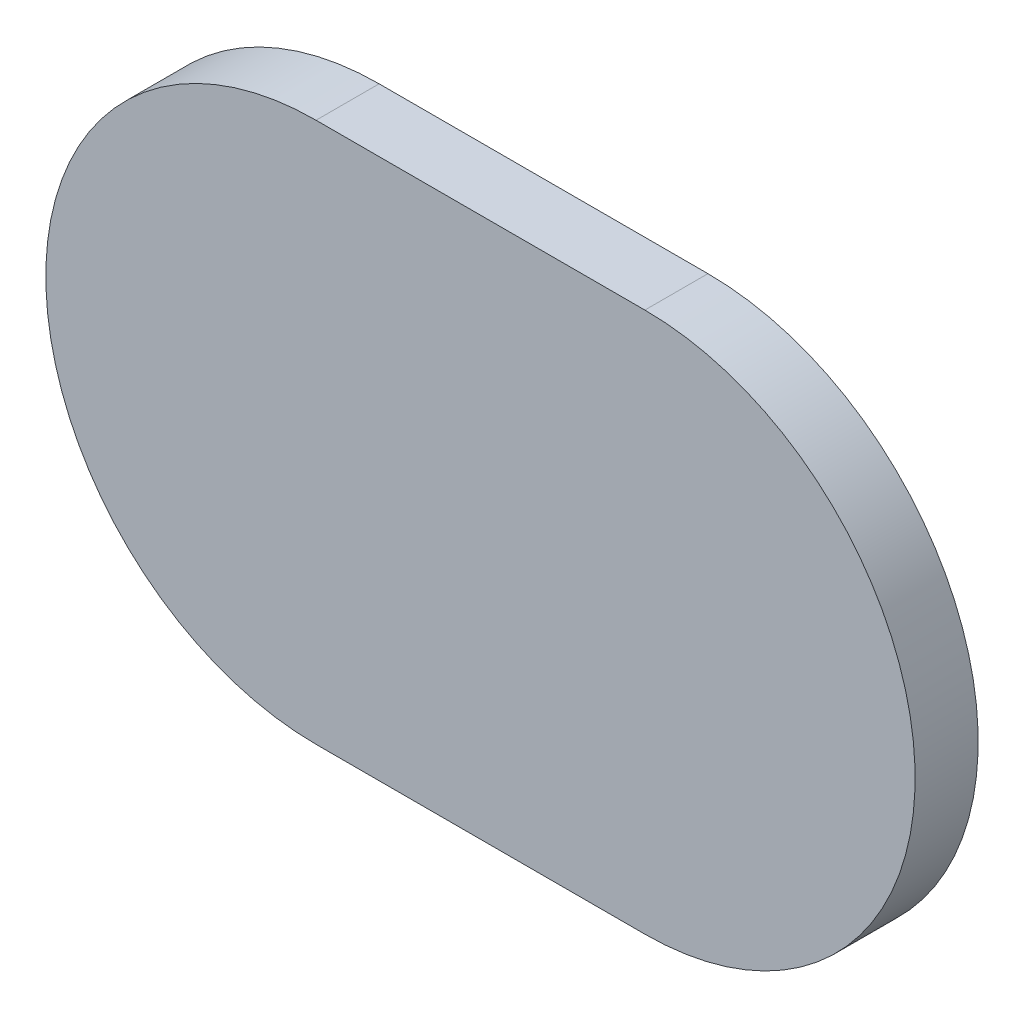
ISO-10303-21;
HEADER;
FILE_DESCRIPTION(('STEP AP214'),'2;1');
FILE_NAME('part.step','',(''),(''),'','','');
FILE_SCHEMA(('AUTOMOTIVE_DESIGN { 1 0 10303 214 1 1 1 1 }'));
ENDSEC;
DATA;
#1=APPLICATION_CONTEXT('core data for automotive mechanical design processes');
#2=APPLICATION_PROTOCOL_DEFINITION('international standard','automotive_design',2000,#1);
#3=PRODUCT_CONTEXT('',#1,'mechanical');
#4=PRODUCT('Part','Part','',(#3));
#5=PRODUCT_RELATED_PRODUCT_CATEGORY('part','',(#4));
#6=PRODUCT_DEFINITION_FORMATION('','',#4);
#7=PRODUCT_DEFINITION_CONTEXT('part definition',#1,'design');
#8=PRODUCT_DEFINITION('design','',#6,#7);
#9=PRODUCT_DEFINITION_SHAPE('','',#8);
#10=(LENGTH_UNIT() NAMED_UNIT(*) SI_UNIT(.MILLI.,.METRE.));
#11=(NAMED_UNIT(*) PLANE_ANGLE_UNIT() SI_UNIT($,.RADIAN.));
#12=(NAMED_UNIT(*) SI_UNIT($,.STERADIAN.) SOLID_ANGLE_UNIT());
#13=UNCERTAINTY_MEASURE_WITH_UNIT(LENGTH_MEASURE(1.E-05),#10,'distance_accuracy_value','');
#14=(GEOMETRIC_REPRESENTATION_CONTEXT(3) GLOBAL_UNCERTAINTY_ASSIGNED_CONTEXT((#13)) GLOBAL_UNIT_ASSIGNED_CONTEXT((#10,
#11,#12)) REPRESENTATION_CONTEXT('',''));
#15=CARTESIAN_POINT('',(0.,0.,0.));
#16=DIRECTION('',(0.,0.,1.));
#17=DIRECTION('',(1.,0.,0.));
#18=AXIS2_PLACEMENT_3D('',#15,#16,#17);
#19=CARTESIAN_POINT('',(131.412499,-63.85,1.635));
#20=DIRECTION('',(0.,0.,1.));
#21=DIRECTION('',(1.,0.,0.));
#22=AXIS2_PLACEMENT_3D('',#19,#20,#21);
#23=PLANE('',#22);
#24=DIRECTION('',(-0.999999999984988,-5.47942201664793E-06,0.));
#25=VECTOR('',#24,1.);
#26=CARTESIAN_POINT('',(131.412499,-63.85,1.635));
#27=LINE('',#26,#25);
#28=CARTESIAN_POINT('',(131.412499,-63.85,1.635));
#29=VERTEX_POINT('',#28);
#30=CARTESIAN_POINT('',(131.229998,-63.850001,1.635));
#31=VERTEX_POINT('',#30);
#32=EDGE_CURVE('E93',#29,#31,#27,.T.);
#33=ORIENTED_EDGE('',*,*,#32,.T.);
#34=CARTESIAN_POINT('',(131.2299985,-64.0000005,1.635));
#35=DIRECTION('',(0.,0.,1.));
#36=DIRECTION('',(-3.33334424656948E-06,0.999999999994444,0.));
#37=AXIS2_PLACEMENT_3D('',#34,#35,#36);
#38=CIRCLE('',#37,0.149999500001);
#39=CARTESIAN_POINT('',(131.229999,-64.15,1.635));
#40=VERTEX_POINT('',#39);
#41=EDGE_CURVE('E72',#31,#40,#38,.T.);
#42=ORIENTED_EDGE('',*,*,#41,.T.);
#43=DIRECTION('',(0.999999999984988,5.47942209451493E-06,0.));
#44=VECTOR('',#43,1.);
#45=CARTESIAN_POINT('',(131.229999,-64.15,1.635));
#46=LINE('',#45,#44);
#47=CARTESIAN_POINT('',(131.4125,-64.149999,1.635));
#48=VERTEX_POINT('',#47);
#49=EDGE_CURVE('E86',#40,#48,#46,.T.);
#50=ORIENTED_EDGE('',*,*,#49,.T.);
#51=CARTESIAN_POINT('',(131.4124995,-63.9999995,1.635));
#52=DIRECTION('',(0.,0.,1.));
#53=DIRECTION('',(3.33334424656948E-06,-0.999999999994444,0.));
#54=AXIS2_PLACEMENT_3D('',#51,#52,#53);
#55=CIRCLE('',#54,0.149999500001);
#56=EDGE_CURVE('E11',#48,#29,#55,.T.);
#57=ORIENTED_EDGE('',*,*,#56,.T.);
#58=EDGE_LOOP('',(#33,#42,#50,#57));
#59=FACE_BOUND('',#58,.T.);
#60=ADVANCED_FACE('F17',(#59),#23,.T.);
#61=CARTESIAN_POINT('',(131.412499,-63.85,1.6));
#62=DIRECTION('',(0.,0.,1.));
#63=DIRECTION('',(1.,0.,0.));
#64=AXIS2_PLACEMENT_3D('',#61,#62,#63);
#65=PLANE('',#64);
#66=CARTESIAN_POINT('',(131.4124995,-63.9999995,1.6));
#67=DIRECTION('',(0.,0.,1.));
#68=DIRECTION('',(3.33334424656948E-06,-0.999999999994444,0.));
#69=AXIS2_PLACEMENT_3D('',#66,#67,#68);
#70=CIRCLE('',#69,0.149999500001);
#71=CARTESIAN_POINT('',(131.4125,-64.149999,1.6));
#72=VERTEX_POINT('',#71);
#73=CARTESIAN_POINT('',(131.412499,-63.85,1.6));
#74=VERTEX_POINT('',#73);
#75=EDGE_CURVE('E25',#72,#74,#70,.T.);
#76=ORIENTED_EDGE('',*,*,#75,.F.);
#77=DIRECTION('',(0.999999999984988,5.47942209451493E-06,0.));
#78=VECTOR('',#77,1.);
#79=CARTESIAN_POINT('',(131.229999,-64.15,1.6));
#80=LINE('',#79,#78);
#81=CARTESIAN_POINT('',(131.229999,-64.15,1.6));
#82=VERTEX_POINT('',#81);
#83=EDGE_CURVE('E57',#82,#72,#80,.T.);
#84=ORIENTED_EDGE('',*,*,#83,.F.);
#85=CARTESIAN_POINT('',(131.2299985,-64.0000005,1.6));
#86=DIRECTION('',(0.,0.,1.));
#87=DIRECTION('',(-3.33334424656948E-06,0.999999999994444,0.));
#88=AXIS2_PLACEMENT_3D('',#85,#86,#87);
#89=CIRCLE('',#88,0.149999500001);
#90=CARTESIAN_POINT('',(131.229998,-63.850001,1.6));
#91=VERTEX_POINT('',#90);
#92=EDGE_CURVE('E95',#91,#82,#89,.T.);
#93=ORIENTED_EDGE('',*,*,#92,.F.);
#94=DIRECTION('',(-0.999999999984988,-5.47942201664793E-06,0.));
#95=VECTOR('',#94,1.);
#96=CARTESIAN_POINT('',(131.412499,-63.85,1.6));
#97=LINE('',#96,#95);
#98=EDGE_CURVE('E92',#74,#91,#97,.T.);
#99=ORIENTED_EDGE('',*,*,#98,.F.);
#100=EDGE_LOOP('',(#76,#84,#93,#99));
#101=FACE_BOUND('',#100,.T.);
#102=ADVANCED_FACE('F97',(#101),#65,.F.);
#103=CARTESIAN_POINT('',(131.4124995,-63.9999995,1.6));
#104=DIRECTION('',(0.,0.,-1.));
#105=DIRECTION('',(3.33334424656948E-06,-0.999999999994444,0.));
#106=AXIS2_PLACEMENT_3D('',#103,#104,#105);
#107=CYLINDRICAL_SURFACE('',#106,0.149999500001);
#108=ORIENTED_EDGE('',*,*,#75,.T.);
#109=DIRECTION('',(0.,0.,1.));
#110=VECTOR('',#109,1.);
#111=CARTESIAN_POINT('',(131.412499,-63.85,1.6));
#112=LINE('',#111,#110);
#113=EDGE_CURVE('E81',#74,#29,#112,.T.);
#114=ORIENTED_EDGE('',*,*,#113,.T.);
#115=ORIENTED_EDGE('',*,*,#56,.F.);
#116=DIRECTION('',(0.,0.,1.));
#117=VECTOR('',#116,1.);
#118=CARTESIAN_POINT('',(131.4125,-64.149999,1.6));
#119=LINE('',#118,#117);
#120=EDGE_CURVE('E84',#72,#48,#119,.T.);
#121=ORIENTED_EDGE('',*,*,#120,.F.);
#122=EDGE_LOOP('',(#108,#114,#115,#121));
#123=FACE_BOUND('',#122,.T.);
#124=ADVANCED_FACE('F80',(#123),#107,.T.);
#125=CARTESIAN_POINT('',(131.229999,-64.15,1.6));
#126=DIRECTION('',(-5.47942209451493E-06,0.999999999984988,0.));
#127=DIRECTION('',(0.,0.,1.));
#128=AXIS2_PLACEMENT_3D('',#125,#126,#127);
#129=PLANE('',#128);
#130=ORIENTED_EDGE('',*,*,#83,.T.);
#131=ORIENTED_EDGE('',*,*,#120,.T.);
#132=ORIENTED_EDGE('',*,*,#49,.F.);
#133=DIRECTION('',(0.,0.,1.));
#134=VECTOR('',#133,1.);
#135=CARTESIAN_POINT('',(131.229999,-64.15,1.6));
#136=LINE('',#135,#134);
#137=EDGE_CURVE('E113',#82,#40,#136,.T.);
#138=ORIENTED_EDGE('',*,*,#137,.F.);
#139=EDGE_LOOP('',(#130,#131,#132,#138));
#140=FACE_BOUND('',#139,.T.);
#141=ADVANCED_FACE('F126',(#140),#129,.F.);
#142=CARTESIAN_POINT('',(131.2299985,-64.0000005,1.6));
#143=DIRECTION('',(0.,0.,-1.));
#144=DIRECTION('',(-3.33334424656948E-06,0.999999999994444,0.));
#145=AXIS2_PLACEMENT_3D('',#142,#143,#144);
#146=CYLINDRICAL_SURFACE('',#145,0.149999500001);
#147=ORIENTED_EDGE('',*,*,#92,.T.);
#148=ORIENTED_EDGE('',*,*,#137,.T.);
#149=ORIENTED_EDGE('',*,*,#41,.F.);
#150=DIRECTION('',(0.,0.,1.));
#151=VECTOR('',#150,1.);
#152=CARTESIAN_POINT('',(131.229998,-63.850001,1.6));
#153=LINE('',#152,#151);
#154=EDGE_CURVE('E100',#91,#31,#153,.T.);
#155=ORIENTED_EDGE('',*,*,#154,.F.);
#156=EDGE_LOOP('',(#147,#148,#149,#155));
#157=FACE_BOUND('',#156,.T.);
#158=ADVANCED_FACE('F127',(#157),#146,.T.);
#159=CARTESIAN_POINT('',(131.412499,-63.85,1.6));
#160=DIRECTION('',(5.47942201664793E-06,-0.999999999984988,0.));
#161=DIRECTION('',(0.,0.,-1.));
#162=AXIS2_PLACEMENT_3D('',#159,#160,#161);
#163=PLANE('',#162);
#164=ORIENTED_EDGE('',*,*,#98,.T.);
#165=ORIENTED_EDGE('',*,*,#154,.T.);
#166=ORIENTED_EDGE('',*,*,#32,.F.);
#167=ORIENTED_EDGE('',*,*,#113,.F.);
#168=EDGE_LOOP('',(#164,#165,#166,#167));
#169=FACE_BOUND('',#168,.T.);
#170=ADVANCED_FACE('F90',(#169),#163,.F.);
#171=CLOSED_SHELL('',(#60,#102,#124,#141,#158,#170));
#172=MANIFOLD_SOLID_BREP('B1',#171);
#173=ADVANCED_BREP_SHAPE_REPRESENTATION('',(#18,#172),#14);
#174=SHAPE_DEFINITION_REPRESENTATION(#9,#173);
ENDSEC;
END-ISO-10303-21;
